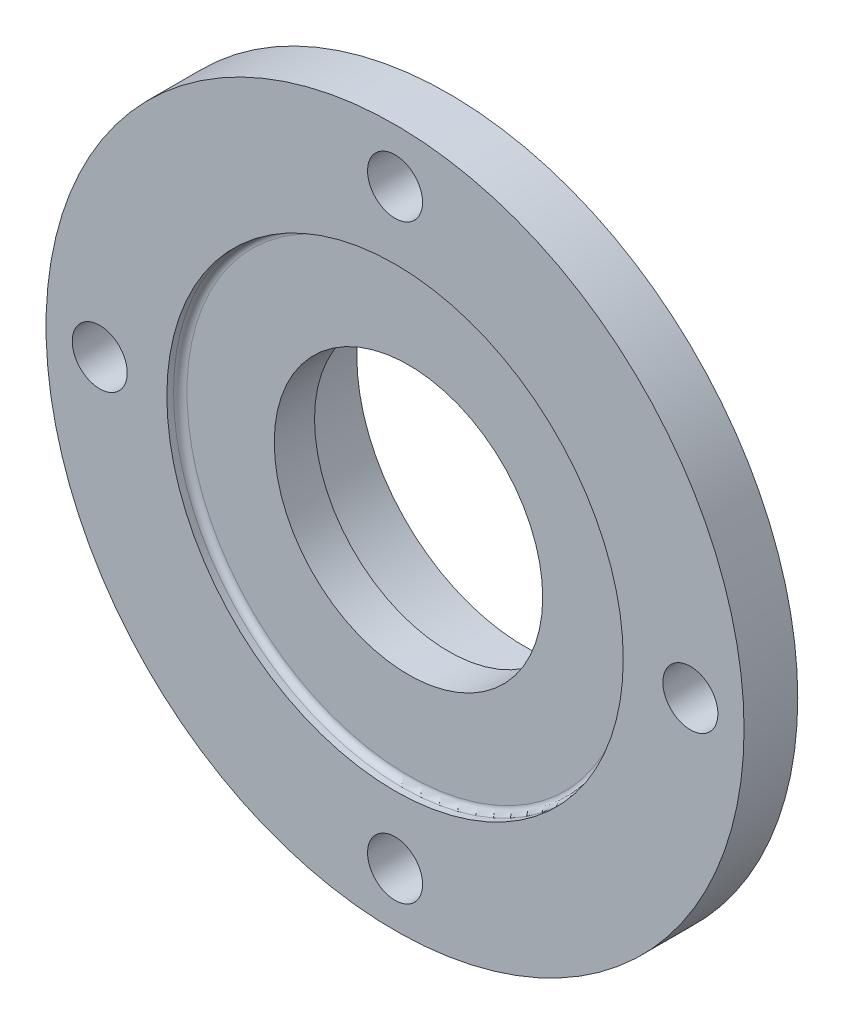
ISO-10303-21;
HEADER;
FILE_DESCRIPTION(('STEP AP214'),'2;1');
FILE_NAME('part.step','',(''),(''),'','','');
FILE_SCHEMA(('AUTOMOTIVE_DESIGN { 1 0 10303 214 1 1 1 1 }'));
ENDSEC;
DATA;
#1=APPLICATION_CONTEXT('core data for automotive mechanical design processes');
#2=APPLICATION_PROTOCOL_DEFINITION('international standard','automotive_design',2000,#1);
#3=PRODUCT_CONTEXT('',#1,'mechanical');
#4=PRODUCT('Part','Part','',(#3));
#5=PRODUCT_RELATED_PRODUCT_CATEGORY('part','',(#4));
#6=PRODUCT_DEFINITION_FORMATION('','',#4);
#7=PRODUCT_DEFINITION_CONTEXT('part definition',#1,'design');
#8=PRODUCT_DEFINITION('design','',#6,#7);
#9=PRODUCT_DEFINITION_SHAPE('','',#8);
#10=(LENGTH_UNIT() NAMED_UNIT(*) SI_UNIT(.MILLI.,.METRE.));
#11=(NAMED_UNIT(*) PLANE_ANGLE_UNIT() SI_UNIT($,.RADIAN.));
#12=(NAMED_UNIT(*) SI_UNIT($,.STERADIAN.) SOLID_ANGLE_UNIT());
#13=UNCERTAINTY_MEASURE_WITH_UNIT(LENGTH_MEASURE(1.E-05),#10,'distance_accuracy_value','');
#14=(GEOMETRIC_REPRESENTATION_CONTEXT(3) GLOBAL_UNCERTAINTY_ASSIGNED_CONTEXT((#13)) GLOBAL_UNIT_ASSIGNED_CONTEXT((#10,
#11,#12)) REPRESENTATION_CONTEXT('',''));
#15=CARTESIAN_POINT('',(0.,0.,0.));
#16=DIRECTION('',(0.,0.,1.));
#17=DIRECTION('',(1.,0.,0.));
#18=AXIS2_PLACEMENT_3D('',#15,#16,#17);
#19=CARTESIAN_POINT('',(0.,0.,8.));
#20=DIRECTION('',(0.,0.,1.));
#21=DIRECTION('',(1.,0.,0.));
#22=AXIS2_PLACEMENT_3D('',#19,#20,#21);
#23=PLANE('',#22);
#24=CARTESIAN_POINT('',(0.,0.,8.));
#25=DIRECTION('',(0.,0.,1.));
#26=DIRECTION('',(1.,0.,0.));
#27=AXIS2_PLACEMENT_3D('',#24,#25,#26);
#28=CIRCLE('',#27,34.);
#29=CARTESIAN_POINT('',(34.,0.,8.));
#30=VERTEX_POINT('',#29);
#31=EDGE_CURVE('E111',#30,#30,#28,.T.);
#32=ORIENTED_EDGE('',*,*,#31,.F.);
#33=EDGE_LOOP('',(#32));
#34=FACE_BOUND('',#33,.T.);
#35=CARTESIAN_POINT('',(-3.07250357818196E-13,-44.,8.));
#36=DIRECTION('',(0.,0.,1.));
#37=DIRECTION('',(1.,0.,0.));
#38=AXIS2_PLACEMENT_3D('',#35,#36,#37);
#39=CIRCLE('',#38,4.1);
#40=CARTESIAN_POINT('',(4.09999999999969,-44.,8.));
#41=VERTEX_POINT('',#40);
#42=EDGE_CURVE('E95',#41,#41,#39,.T.);
#43=ORIENTED_EDGE('',*,*,#42,.F.);
#44=EDGE_LOOP('',(#43));
#45=FACE_BOUND('',#44,.T.);
#46=CARTESIAN_POINT('',(0.,44.,8.));
#47=DIRECTION('',(0.,0.,1.));
#48=DIRECTION('',(1.,0.,0.));
#49=AXIS2_PLACEMENT_3D('',#46,#47,#48);
#50=CIRCLE('',#49,4.1);
#51=CARTESIAN_POINT('',(4.1,44.,8.));
#52=VERTEX_POINT('',#51);
#53=EDGE_CURVE('E79',#52,#52,#50,.T.);
#54=ORIENTED_EDGE('',*,*,#53,.F.);
#55=EDGE_LOOP('',(#54));
#56=FACE_BOUND('',#55,.T.);
#57=CARTESIAN_POINT('',(0.,0.,8.));
#58=DIRECTION('',(0.,0.,1.));
#59=DIRECTION('',(1.,0.,0.));
#60=AXIS2_PLACEMENT_3D('',#57,#58,#59);
#61=CIRCLE('',#60,52.);
#62=CARTESIAN_POINT('',(52.,0.,8.));
#63=VERTEX_POINT('',#62);
#64=EDGE_CURVE('E74',#63,#63,#61,.T.);
#65=ORIENTED_EDGE('',*,*,#64,.T.);
#66=EDGE_LOOP('',(#65));
#67=FACE_BOUND('',#66,.T.);
#68=CARTESIAN_POINT('',(44.,-1.53625178909098E-13,8.));
#69=DIRECTION('',(0.,0.,1.));
#70=DIRECTION('',(1.,0.,0.));
#71=AXIS2_PLACEMENT_3D('',#68,#69,#70);
#72=CIRCLE('',#71,4.1);
#73=CARTESIAN_POINT('',(48.1,-1.53625178909098E-13,8.));
#74=VERTEX_POINT('',#73);
#75=EDGE_CURVE('E87',#74,#74,#72,.T.);
#76=ORIENTED_EDGE('',*,*,#75,.F.);
#77=EDGE_LOOP('',(#76));
#78=FACE_BOUND('',#77,.T.);
#79=CARTESIAN_POINT('',(-44.,4.60875536727294E-13,8.));
#80=DIRECTION('',(0.,0.,1.));
#81=DIRECTION('',(1.,0.,0.));
#82=AXIS2_PLACEMENT_3D('',#79,#80,#81);
#83=CIRCLE('',#82,4.1);
#84=CARTESIAN_POINT('',(-39.9,4.60875536727294E-13,8.));
#85=VERTEX_POINT('',#84);
#86=EDGE_CURVE('E103',#85,#85,#83,.T.);
#87=ORIENTED_EDGE('',*,*,#86,.F.);
#88=EDGE_LOOP('',(#87));
#89=FACE_BOUND('',#88,.T.);
#90=ADVANCED_FACE('F45',(#34,#45,#56,#67,#78,#89),#23,.T.);
#91=CARTESIAN_POINT('',(0.,0.,0.));
#92=DIRECTION('',(0.,0.,1.));
#93=DIRECTION('',(1.,0.,0.));
#94=AXIS2_PLACEMENT_3D('',#91,#92,#93);
#95=PLANE('',#94);
#96=CARTESIAN_POINT('',(0.,0.,0.));
#97=DIRECTION('',(0.,0.,1.));
#98=DIRECTION('',(1.,0.,0.));
#99=AXIS2_PLACEMENT_3D('',#96,#97,#98);
#100=CIRCLE('',#99,34.);
#101=CARTESIAN_POINT('',(34.,0.,0.));
#102=VERTEX_POINT('',#101);
#103=EDGE_CURVE('E60',#102,#102,#100,.F.);
#104=ORIENTED_EDGE('',*,*,#103,.F.);
#105=EDGE_LOOP('',(#104));
#106=FACE_BOUND('',#105,.T.);
#107=CARTESIAN_POINT('',(0.,0.,0.));
#108=DIRECTION('',(0.,0.,1.));
#109=DIRECTION('',(1.,0.,0.));
#110=AXIS2_PLACEMENT_3D('',#107,#108,#109);
#111=CIRCLE('',#110,52.);
#112=CARTESIAN_POINT('',(52.,0.,0.));
#113=VERTEX_POINT('',#112);
#114=EDGE_CURVE('E75',#113,#113,#111,.T.);
#115=ORIENTED_EDGE('',*,*,#114,.F.);
#116=EDGE_LOOP('',(#115));
#117=FACE_BOUND('',#116,.T.);
#118=CARTESIAN_POINT('',(0.,44.,0.));
#119=DIRECTION('',(0.,0.,1.));
#120=DIRECTION('',(1.,0.,0.));
#121=AXIS2_PLACEMENT_3D('',#118,#119,#120);
#122=CIRCLE('',#121,4.1);
#123=CARTESIAN_POINT('',(4.1,44.,0.));
#124=VERTEX_POINT('',#123);
#125=EDGE_CURVE('E83',#124,#124,#122,.T.);
#126=ORIENTED_EDGE('',*,*,#125,.T.);
#127=EDGE_LOOP('',(#126));
#128=FACE_BOUND('',#127,.T.);
#129=CARTESIAN_POINT('',(44.,-1.53625178909098E-13,0.));
#130=DIRECTION('',(0.,0.,1.));
#131=DIRECTION('',(1.,0.,0.));
#132=AXIS2_PLACEMENT_3D('',#129,#130,#131);
#133=CIRCLE('',#132,4.1);
#134=CARTESIAN_POINT('',(48.1,-1.53625178909098E-13,0.));
#135=VERTEX_POINT('',#134);
#136=EDGE_CURVE('E91',#135,#135,#133,.T.);
#137=ORIENTED_EDGE('',*,*,#136,.T.);
#138=EDGE_LOOP('',(#137));
#139=FACE_BOUND('',#138,.T.);
#140=CARTESIAN_POINT('',(-3.07250357818196E-13,-44.,0.));
#141=DIRECTION('',(0.,0.,1.));
#142=DIRECTION('',(1.,0.,0.));
#143=AXIS2_PLACEMENT_3D('',#140,#141,#142);
#144=CIRCLE('',#143,4.1);
#145=CARTESIAN_POINT('',(4.09999999999969,-44.,0.));
#146=VERTEX_POINT('',#145);
#147=EDGE_CURVE('E99',#146,#146,#144,.T.);
#148=ORIENTED_EDGE('',*,*,#147,.T.);
#149=EDGE_LOOP('',(#148));
#150=FACE_BOUND('',#149,.T.);
#151=CARTESIAN_POINT('',(-44.,4.60875536727294E-13,0.));
#152=DIRECTION('',(0.,0.,1.));
#153=DIRECTION('',(1.,0.,0.));
#154=AXIS2_PLACEMENT_3D('',#151,#152,#153);
#155=CIRCLE('',#154,4.1);
#156=CARTESIAN_POINT('',(-39.9,4.60875536727294E-13,0.));
#157=VERTEX_POINT('',#156);
#158=EDGE_CURVE('E107',#157,#157,#155,.T.);
#159=ORIENTED_EDGE('',*,*,#158,.T.);
#160=EDGE_LOOP('',(#159));
#161=FACE_BOUND('',#160,.T.);
#162=ADVANCED_FACE('F159',(#106,#117,#128,#139,#150,#161),#95,.F.);
#163=CARTESIAN_POINT('',(0.,0.,8.));
#164=DIRECTION('',(0.,0.,-1.));
#165=DIRECTION('',(-1.,0.,0.));
#166=AXIS2_PLACEMENT_3D('',#163,#164,#165);
#167=CYLINDRICAL_SURFACE('',#166,52.);
#168=ORIENTED_EDGE('',*,*,#64,.F.);
#169=EDGE_LOOP('',(#168));
#170=FACE_BOUND('',#169,.T.);
#171=ORIENTED_EDGE('',*,*,#114,.T.);
#172=EDGE_LOOP('',(#171));
#173=FACE_BOUND('',#172,.T.);
#174=ADVANCED_FACE('F165',(#170,#173),#167,.T.);
#175=CARTESIAN_POINT('',(0.,44.,8.));
#176=DIRECTION('',(0.,0.,-1.));
#177=DIRECTION('',(-1.,0.,0.));
#178=AXIS2_PLACEMENT_3D('',#175,#176,#177);
#179=CYLINDRICAL_SURFACE('',#178,4.1);
#180=ORIENTED_EDGE('',*,*,#53,.T.);
#181=EDGE_LOOP('',(#180));
#182=FACE_BOUND('',#181,.T.);
#183=ORIENTED_EDGE('',*,*,#125,.F.);
#184=EDGE_LOOP('',(#183));
#185=FACE_BOUND('',#184,.T.);
#186=ADVANCED_FACE('F172',(#182,#185),#179,.F.);
#187=CARTESIAN_POINT('',(44.,-1.53625178909098E-13,8.));
#188=DIRECTION('',(0.,0.,-1.));
#189=DIRECTION('',(-1.,0.,0.));
#190=AXIS2_PLACEMENT_3D('',#187,#188,#189);
#191=CYLINDRICAL_SURFACE('',#190,4.1);
#192=ORIENTED_EDGE('',*,*,#75,.T.);
#193=EDGE_LOOP('',(#192));
#194=FACE_BOUND('',#193,.T.);
#195=ORIENTED_EDGE('',*,*,#136,.F.);
#196=EDGE_LOOP('',(#195));
#197=FACE_BOUND('',#196,.T.);
#198=ADVANCED_FACE('F179',(#194,#197),#191,.F.);
#199=CARTESIAN_POINT('',(-3.07250357818196E-13,-44.,8.));
#200=DIRECTION('',(0.,0.,-1.));
#201=DIRECTION('',(-1.,0.,0.));
#202=AXIS2_PLACEMENT_3D('',#199,#200,#201);
#203=CYLINDRICAL_SURFACE('',#202,4.1);
#204=ORIENTED_EDGE('',*,*,#42,.T.);
#205=EDGE_LOOP('',(#204));
#206=FACE_BOUND('',#205,.T.);
#207=ORIENTED_EDGE('',*,*,#147,.F.);
#208=EDGE_LOOP('',(#207));
#209=FACE_BOUND('',#208,.T.);
#210=ADVANCED_FACE('F195',(#206,#209),#203,.F.);
#211=CARTESIAN_POINT('',(-44.,4.60875536727294E-13,8.));
#212=DIRECTION('',(0.,0.,-1.));
#213=DIRECTION('',(-1.,0.,0.));
#214=AXIS2_PLACEMENT_3D('',#211,#212,#213);
#215=CYLINDRICAL_SURFACE('',#214,4.1);
#216=ORIENTED_EDGE('',*,*,#86,.T.);
#217=EDGE_LOOP('',(#216));
#218=FACE_BOUND('',#217,.T.);
#219=ORIENTED_EDGE('',*,*,#158,.F.);
#220=EDGE_LOOP('',(#219));
#221=FACE_BOUND('',#220,.T.);
#222=ADVANCED_FACE('F194',(#218,#221),#215,.F.);
#223=CARTESIAN_POINT('',(0.,0.,6.));
#224=DIRECTION('',(0.,0.,1.));
#225=DIRECTION('',(1.,0.,0.));
#226=AXIS2_PLACEMENT_3D('',#223,#224,#225);
#227=CYLINDRICAL_SURFACE('',#226,34.);
#228=CARTESIAN_POINT('',(0.,0.,7.));
#229=DIRECTION('',(0.,0.,1.));
#230=DIRECTION('',(1.,0.,0.));
#231=AXIS2_PLACEMENT_3D('',#228,#229,#230);
#232=CIRCLE('',#231,34.);
#233=CARTESIAN_POINT('',(34.,0.,7.));
#234=VERTEX_POINT('',#233);
#235=EDGE_CURVE('E66',#234,#234,#232,.F.);
#236=ORIENTED_EDGE('',*,*,#235,.T.);
#237=EDGE_LOOP('',(#236));
#238=FACE_BOUND('',#237,.T.);
#239=ORIENTED_EDGE('',*,*,#31,.T.);
#240=EDGE_LOOP('',(#239));
#241=FACE_BOUND('',#240,.T.);
#242=ADVANCED_FACE('F141',(#238,#241),#227,.F.);
#243=CARTESIAN_POINT('',(0.,0.,6.));
#244=DIRECTION('',(0.,0.,1.));
#245=DIRECTION('',(1.,0.,0.));
#246=AXIS2_PLACEMENT_3D('',#243,#244,#245);
#247=PLANE('',#246);
#248=CARTESIAN_POINT('',(0.,0.,6.));
#249=DIRECTION('',(0.,0.,1.));
#250=DIRECTION('',(1.,0.,0.));
#251=AXIS2_PLACEMENT_3D('',#248,#249,#250);
#252=CIRCLE('',#251,20.);
#253=CARTESIAN_POINT('',(20.,0.,6.));
#254=VERTEX_POINT('',#253);
#255=EDGE_CURVE('E50',#254,#254,#252,.T.);
#256=ORIENTED_EDGE('',*,*,#255,.F.);
#257=EDGE_LOOP('',(#256));
#258=FACE_BOUND('',#257,.T.);
#259=CARTESIAN_POINT('',(0.,0.,6.));
#260=DIRECTION('',(0.,0.,1.));
#261=DIRECTION('',(1.,0.,0.));
#262=AXIS2_PLACEMENT_3D('',#259,#260,#261);
#263=CIRCLE('',#262,33.);
#264=CARTESIAN_POINT('',(33.,0.,6.));
#265=VERTEX_POINT('',#264);
#266=EDGE_CURVE('E70',#265,#265,#263,.T.);
#267=ORIENTED_EDGE('',*,*,#266,.T.);
#268=EDGE_LOOP('',(#267));
#269=FACE_BOUND('',#268,.T.);
#270=ADVANCED_FACE('F137',(#258,#269),#247,.T.);
#271=CARTESIAN_POINT('',(0.,0.,7.));
#272=DIRECTION('',(0.,0.,1.));
#273=DIRECTION('',(1.,0.,0.));
#274=AXIS2_PLACEMENT_3D('',#271,#272,#273);
#275=TOROIDAL_SURFACE('',#274,33.,1.);
#276=ORIENTED_EDGE('',*,*,#235,.F.);
#277=EDGE_LOOP('',(#276));
#278=FACE_BOUND('',#277,.T.);
#279=ORIENTED_EDGE('',*,*,#266,.F.);
#280=EDGE_LOOP('',(#279));
#281=FACE_BOUND('',#280,.T.);
#282=ADVANCED_FACE('F140',(#278,#281),#275,.F.);
#283=CARTESIAN_POINT('',(0.,0.,-11.3));
#284=DIRECTION('',(0.,0.,-1.));
#285=DIRECTION('',(-1.,0.,0.));
#286=AXIS2_PLACEMENT_3D('',#283,#284,#285);
#287=PLANE('',#286);
#288=CARTESIAN_POINT('',(0.,0.,-11.3));
#289=DIRECTION('',(0.,0.,-1.));
#290=DIRECTION('',(-1.,0.,0.));
#291=AXIS2_PLACEMENT_3D('',#288,#289,#290);
#292=CIRCLE('',#291,34.);
#293=CARTESIAN_POINT('',(-34.,0.,-11.3));
#294=VERTEX_POINT('',#293);
#295=EDGE_CURVE('E118',#294,#294,#292,.T.);
#296=ORIENTED_EDGE('',*,*,#295,.T.);
#297=EDGE_LOOP('',(#296));
#298=FACE_BOUND('',#297,.T.);
#299=CARTESIAN_POINT('',(0.,0.,-11.3));
#300=DIRECTION('',(0.,0.,-1.));
#301=DIRECTION('',(-1.,0.,0.));
#302=AXIS2_PLACEMENT_3D('',#299,#300,#301);
#303=CIRCLE('',#302,25.);
#304=CARTESIAN_POINT('',(-25.,0.,-11.3));
#305=VERTEX_POINT('',#304);
#306=EDGE_CURVE('E122',#305,#305,#303,.T.);
#307=ORIENTED_EDGE('',*,*,#306,.F.);
#308=EDGE_LOOP('',(#307));
#309=FACE_BOUND('',#308,.T.);
#310=ADVANCED_FACE('F146',(#298,#309),#287,.T.);
#311=CARTESIAN_POINT('',(0.,0.,-11.3));
#312=DIRECTION('',(0.,0.,1.));
#313=DIRECTION('',(1.,0.,0.));
#314=AXIS2_PLACEMENT_3D('',#311,#312,#313);
#315=CYLINDRICAL_SURFACE('',#314,34.);
#316=ORIENTED_EDGE('',*,*,#295,.F.);
#317=EDGE_LOOP('',(#316));
#318=FACE_BOUND('',#317,.T.);
#319=ORIENTED_EDGE('',*,*,#103,.T.);
#320=EDGE_LOOP('',(#319));
#321=FACE_BOUND('',#320,.T.);
#322=ADVANCED_FACE('F153',(#318,#321),#315,.T.);
#323=CARTESIAN_POINT('',(0.,0.,-11.3));
#324=DIRECTION('',(0.,0.,1.));
#325=DIRECTION('',(1.,0.,0.));
#326=AXIS2_PLACEMENT_3D('',#323,#324,#325);
#327=CYLINDRICAL_SURFACE('',#326,25.);
#328=CARTESIAN_POINT('',(0.,0.,-0.399999999999973));
#329=DIRECTION('',(0.,0.,1.));
#330=DIRECTION('',(1.,0.,0.));
#331=AXIS2_PLACEMENT_3D('',#328,#329,#330);
#332=CIRCLE('',#331,25.);
#333=CARTESIAN_POINT('',(25.,0.,-0.399999999999973));
#334=VERTEX_POINT('',#333);
#335=EDGE_CURVE('E10',#334,#334,#332,.T.);
#336=ORIENTED_EDGE('',*,*,#335,.T.);
#337=EDGE_LOOP('',(#336));
#338=FACE_BOUND('',#337,.T.);
#339=ORIENTED_EDGE('',*,*,#306,.T.);
#340=EDGE_LOOP('',(#339));
#341=FACE_BOUND('',#340,.T.);
#342=ADVANCED_FACE('F252',(#338,#341),#327,.F.);
#343=CARTESIAN_POINT('',(0.,0.,0.));
#344=DIRECTION('',(0.,0.,-1.));
#345=DIRECTION('',(-1.,0.,0.));
#346=AXIS2_PLACEMENT_3D('',#343,#344,#345);
#347=CIRCLE('',#346,20.);
#348=CARTESIAN_POINT('',(-20.,0.,0.));
#349=VERTEX_POINT('',#348);
#350=EDGE_CURVE('E126',#349,#349,#347,.T.);
#351=ORIENTED_EDGE('',*,*,#350,.F.);
#352=EDGE_LOOP('',(#351));
#353=FACE_BOUND('',#352,.T.);
#354=CARTESIAN_POINT('',(0.,0.,0.));
#355=DIRECTION('',(0.,0.,1.));
#356=DIRECTION('',(1.,0.,0.));
#357=AXIS2_PLACEMENT_3D('',#354,#355,#356);
#358=CIRCLE('',#357,24.6);
#359=CARTESIAN_POINT('',(24.6,0.,0.));
#360=VERTEX_POINT('',#359);
#361=EDGE_CURVE('E55',#360,#360,#358,.F.);
#362=ORIENTED_EDGE('',*,*,#361,.T.);
#363=EDGE_LOOP('',(#362));
#364=FACE_BOUND('',#363,.T.);
#365=ADVANCED_FACE('F168',(#353,#364),#95,.F.);
#366=CARTESIAN_POINT('',(0.,0.,0.));
#367=DIRECTION('',(0.,0.,-1.));
#368=DIRECTION('',(-1.,0.,0.));
#369=AXIS2_PLACEMENT_3D('',#366,#367,#368);
#370=CONICAL_SURFACE('',#369,24.6,0.78539816339747);
#371=ORIENTED_EDGE('',*,*,#335,.F.);
#372=EDGE_LOOP('',(#371));
#373=FACE_BOUND('',#372,.T.);
#374=ORIENTED_EDGE('',*,*,#361,.F.);
#375=EDGE_LOOP('',(#374));
#376=FACE_BOUND('',#375,.T.);
#377=ADVANCED_FACE('F48',(#373,#376),#370,.F.);
#378=CARTESIAN_POINT('',(0.,0.,10.));
#379=DIRECTION('',(0.,0.,-1.));
#380=DIRECTION('',(-1.,0.,0.));
#381=AXIS2_PLACEMENT_3D('',#378,#379,#380);
#382=CYLINDRICAL_SURFACE('',#381,20.);
#383=ORIENTED_EDGE('',*,*,#255,.T.);
#384=EDGE_LOOP('',(#383));
#385=FACE_BOUND('',#384,.T.);
#386=ORIENTED_EDGE('',*,*,#350,.T.);
#387=EDGE_LOOP('',(#386));
#388=FACE_BOUND('',#387,.T.);
#389=ADVANCED_FACE('F135',(#385,#388),#382,.F.);
#390=CLOSED_SHELL('',(#90,#162,#174,#186,#198,#210,#222,#242,#270,#282,#310,#322,#342,#365,#377,#389));
#391=MANIFOLD_SOLID_BREP('B2',#390);
#392=ADVANCED_BREP_SHAPE_REPRESENTATION('',(#18,#391),#14);
#393=SHAPE_DEFINITION_REPRESENTATION(#9,#392);
ENDSEC;
END-ISO-10303-21;
